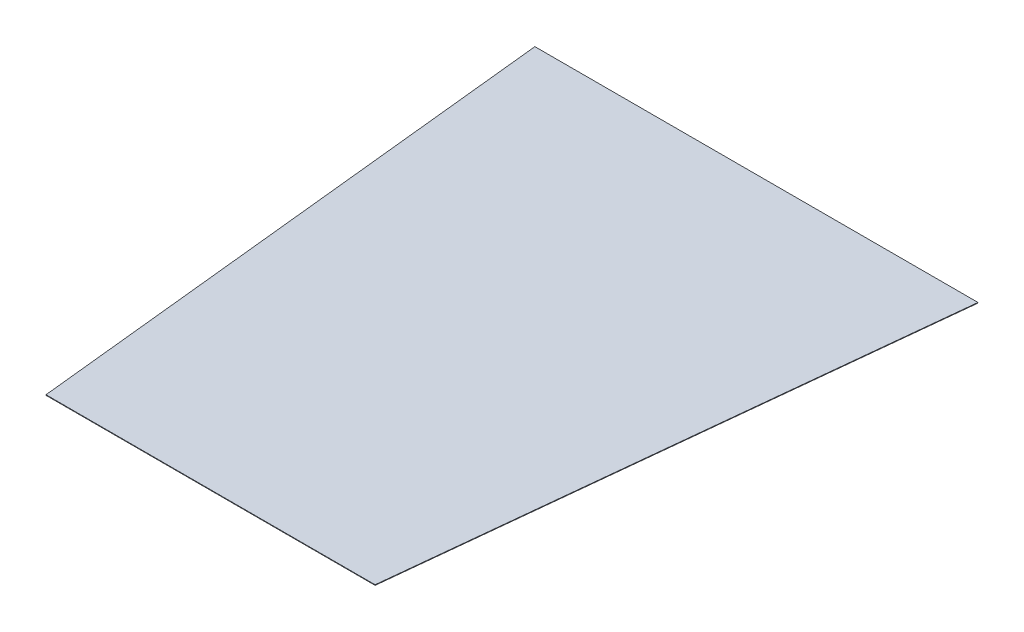
ISO-10303-21;
HEADER;
FILE_DESCRIPTION(('STEP AP214'),'2;1');
FILE_NAME('part.step','',(''),(''),'','','');
FILE_SCHEMA(('AUTOMOTIVE_DESIGN { 1 0 10303 214 1 1 1 1 }'));
ENDSEC;
DATA;
#1=APPLICATION_CONTEXT('core data for automotive mechanical design processes');
#2=APPLICATION_PROTOCOL_DEFINITION('international standard','automotive_design',2000,#1);
#3=PRODUCT_CONTEXT('',#1,'mechanical');
#4=PRODUCT('Part','Part','',(#3));
#5=PRODUCT_RELATED_PRODUCT_CATEGORY('part','',(#4));
#6=PRODUCT_DEFINITION_FORMATION('','',#4);
#7=PRODUCT_DEFINITION_CONTEXT('part definition',#1,'design');
#8=PRODUCT_DEFINITION('design','',#6,#7);
#9=PRODUCT_DEFINITION_SHAPE('','',#8);
#10=(LENGTH_UNIT() NAMED_UNIT(*) SI_UNIT(.MILLI.,.METRE.));
#11=(NAMED_UNIT(*) PLANE_ANGLE_UNIT() SI_UNIT($,.RADIAN.));
#12=(NAMED_UNIT(*) SI_UNIT($,.STERADIAN.) SOLID_ANGLE_UNIT());
#13=UNCERTAINTY_MEASURE_WITH_UNIT(LENGTH_MEASURE(1.E-05),#10,'distance_accuracy_value','');
#14=(GEOMETRIC_REPRESENTATION_CONTEXT(3) GLOBAL_UNCERTAINTY_ASSIGNED_CONTEXT((#13)) GLOBAL_UNIT_ASSIGNED_CONTEXT((#10,
#11,#12)) REPRESENTATION_CONTEXT('',''));
#15=CARTESIAN_POINT('',(0.,0.,0.));
#16=DIRECTION('',(0.,0.,1.));
#17=DIRECTION('',(1.,0.,0.));
#18=AXIS2_PLACEMENT_3D('',#15,#16,#17);
#19=CARTESIAN_POINT('',(-294.245,1.,0.));
#20=DIRECTION('',(0.994593441915868,0.,-0.103845487614758));
#21=DIRECTION('',(-0.103845487614758,0.,-0.994593441915868));
#22=AXIS2_PLACEMENT_3D('',#19,#20,#21);
#23=PLANE('',#22);
#24=DIRECTION('',(0.103845487614758,0.,0.994593441915868));
#25=VECTOR('',#24,1.);
#26=CARTESIAN_POINT('',(-294.245,0.,0.));
#27=LINE('',#26,#25);
#28=CARTESIAN_POINT('',(-396.16,0.,-976.103949830652));
#29=VERTEX_POINT('',#28);
#30=CARTESIAN_POINT('',(-294.245,0.,0.));
#31=VERTEX_POINT('',#30);
#32=EDGE_CURVE('E97',#29,#31,#27,.T.);
#33=ORIENTED_EDGE('',*,*,#32,.T.);
#34=DIRECTION('',(0.,-1.,0.));
#35=VECTOR('',#34,1.);
#36=CARTESIAN_POINT('',(-294.245,1.,0.));
#37=LINE('',#36,#35);
#38=CARTESIAN_POINT('',(-294.245,1.,0.));
#39=VERTEX_POINT('',#38);
#40=EDGE_CURVE('E11',#39,#31,#37,.T.);
#41=ORIENTED_EDGE('',*,*,#40,.F.);
#42=DIRECTION('',(0.103845487614758,0.,0.994593441915868));
#43=VECTOR('',#42,1.);
#44=CARTESIAN_POINT('',(-294.245,1.,0.));
#45=LINE('',#44,#43);
#46=CARTESIAN_POINT('',(-396.16,1.,-976.103949830652));
#47=VERTEX_POINT('',#46);
#48=EDGE_CURVE('E85',#47,#39,#45,.T.);
#49=ORIENTED_EDGE('',*,*,#48,.F.);
#50=DIRECTION('',(0.,-1.,0.));
#51=VECTOR('',#50,1.);
#52=CARTESIAN_POINT('',(-396.16,1.,-976.103949830652));
#53=LINE('',#52,#51);
#54=EDGE_CURVE('E93',#47,#29,#53,.T.);
#55=ORIENTED_EDGE('',*,*,#54,.T.);
#56=EDGE_LOOP('',(#33,#41,#49,#55));
#57=FACE_BOUND('',#56,.T.);
#58=ADVANCED_FACE('F34',(#57),#23,.F.);
#59=CARTESIAN_POINT('',(-294.245,1.,0.));
#60=DIRECTION('',(0.,0.,-1.));
#61=DIRECTION('',(-1.,0.,0.));
#62=AXIS2_PLACEMENT_3D('',#59,#60,#61);
#63=PLANE('',#62);
#64=DIRECTION('',(1.,0.,0.));
#65=VECTOR('',#64,1.);
#66=CARTESIAN_POINT('',(-294.245,0.,0.));
#67=LINE('',#66,#65);
#68=CARTESIAN_POINT('',(294.245,0.,0.));
#69=VERTEX_POINT('',#68);
#70=EDGE_CURVE('E89',#31,#69,#67,.T.);
#71=ORIENTED_EDGE('',*,*,#70,.T.);
#72=DIRECTION('',(0.,-1.,0.));
#73=VECTOR('',#72,1.);
#74=CARTESIAN_POINT('',(294.245,1.,0.));
#75=LINE('',#74,#73);
#76=CARTESIAN_POINT('',(294.245,1.,0.));
#77=VERTEX_POINT('',#76);
#78=EDGE_CURVE('E42',#77,#69,#75,.T.);
#79=ORIENTED_EDGE('',*,*,#78,.F.);
#80=DIRECTION('',(1.,0.,0.));
#81=VECTOR('',#80,1.);
#82=CARTESIAN_POINT('',(-294.245,1.,0.));
#83=LINE('',#82,#81);
#84=EDGE_CURVE('E80',#39,#77,#83,.T.);
#85=ORIENTED_EDGE('',*,*,#84,.F.);
#86=ORIENTED_EDGE('',*,*,#40,.T.);
#87=EDGE_LOOP('',(#71,#79,#85,#86));
#88=FACE_BOUND('',#87,.T.);
#89=ADVANCED_FACE('F88',(#88),#63,.F.);
#90=CARTESIAN_POINT('',(396.16,1.,-976.103949830652));
#91=DIRECTION('',(-0.994593441915868,0.,-0.103845487614758));
#92=DIRECTION('',(-0.103845487614758,0.,0.994593441915868));
#93=AXIS2_PLACEMENT_3D('',#90,#91,#92);
#94=PLANE('',#93);
#95=DIRECTION('',(0.103845487614758,0.,-0.994593441915868));
#96=VECTOR('',#95,1.);
#97=CARTESIAN_POINT('',(396.16,0.,-976.103949830652));
#98=LINE('',#97,#96);
#99=CARTESIAN_POINT('',(396.16,0.,-976.103949830652));
#100=VERTEX_POINT('',#99);
#101=EDGE_CURVE('E67',#69,#100,#98,.T.);
#102=ORIENTED_EDGE('',*,*,#101,.T.);
#103=DIRECTION('',(0.,-1.,0.));
#104=VECTOR('',#103,1.);
#105=CARTESIAN_POINT('',(396.16,1.,-976.103949830652));
#106=LINE('',#105,#104);
#107=CARTESIAN_POINT('',(396.16,1.,-976.103949830652));
#108=VERTEX_POINT('',#107);
#109=EDGE_CURVE('E90',#108,#100,#106,.T.);
#110=ORIENTED_EDGE('',*,*,#109,.F.);
#111=DIRECTION('',(0.103845487614758,0.,-0.994593441915868));
#112=VECTOR('',#111,1.);
#113=CARTESIAN_POINT('',(396.16,1.,-976.103949830652));
#114=LINE('',#113,#112);
#115=EDGE_CURVE('E83',#77,#108,#114,.T.);
#116=ORIENTED_EDGE('',*,*,#115,.F.);
#117=ORIENTED_EDGE('',*,*,#78,.T.);
#118=EDGE_LOOP('',(#102,#110,#116,#117));
#119=FACE_BOUND('',#118,.T.);
#120=ADVANCED_FACE('F91',(#119),#94,.F.);
#121=CARTESIAN_POINT('',(-396.16,1.,-976.103949830652));
#122=DIRECTION('',(0.,0.,1.));
#123=DIRECTION('',(1.,0.,0.));
#124=AXIS2_PLACEMENT_3D('',#121,#122,#123);
#125=PLANE('',#124);
#126=DIRECTION('',(-1.,0.,0.));
#127=VECTOR('',#126,1.);
#128=CARTESIAN_POINT('',(-396.16,0.,-976.103949830652));
#129=LINE('',#128,#127);
#130=EDGE_CURVE('E73',#100,#29,#129,.T.);
#131=ORIENTED_EDGE('',*,*,#130,.T.);
#132=ORIENTED_EDGE('',*,*,#54,.F.);
#133=DIRECTION('',(-1.,0.,0.));
#134=VECTOR('',#133,1.);
#135=CARTESIAN_POINT('',(-396.16,1.,-976.103949830652));
#136=LINE('',#135,#134);
#137=EDGE_CURVE('E50',#108,#47,#136,.T.);
#138=ORIENTED_EDGE('',*,*,#137,.F.);
#139=ORIENTED_EDGE('',*,*,#109,.T.);
#140=EDGE_LOOP('',(#131,#132,#138,#139));
#141=FACE_BOUND('',#140,.T.);
#142=ADVANCED_FACE('F104',(#141),#125,.F.);
#143=CARTESIAN_POINT('',(0.,1.,0.));
#144=DIRECTION('',(0.,-1.,0.));
#145=DIRECTION('',(0.,0.,-1.));
#146=AXIS2_PLACEMENT_3D('',#143,#144,#145);
#147=PLANE('',#146);
#148=ORIENTED_EDGE('',*,*,#48,.T.);
#149=ORIENTED_EDGE('',*,*,#84,.T.);
#150=ORIENTED_EDGE('',*,*,#115,.T.);
#151=ORIENTED_EDGE('',*,*,#137,.T.);
#152=EDGE_LOOP('',(#148,#149,#150,#151));
#153=FACE_BOUND('',#152,.T.);
#154=ADVANCED_FACE('F81',(#153),#147,.F.);
#155=CARTESIAN_POINT('',(0.,0.,0.));
#156=DIRECTION('',(0.,-1.,0.));
#157=DIRECTION('',(0.,0.,-1.));
#158=AXIS2_PLACEMENT_3D('',#155,#156,#157);
#159=PLANE('',#158);
#160=ORIENTED_EDGE('',*,*,#32,.F.);
#161=ORIENTED_EDGE('',*,*,#130,.F.);
#162=ORIENTED_EDGE('',*,*,#101,.F.);
#163=ORIENTED_EDGE('',*,*,#70,.F.);
#164=EDGE_LOOP('',(#160,#161,#162,#163));
#165=FACE_BOUND('',#164,.T.);
#166=ADVANCED_FACE('F107',(#165),#159,.T.);
#167=CLOSED_SHELL('',(#58,#89,#120,#142,#154,#166));
#168=MANIFOLD_SOLID_BREP('B2',#167);
#169=ADVANCED_BREP_SHAPE_REPRESENTATION('',(#18,#168),#14);
#170=SHAPE_DEFINITION_REPRESENTATION(#9,#169);
ENDSEC;
END-ISO-10303-21;
